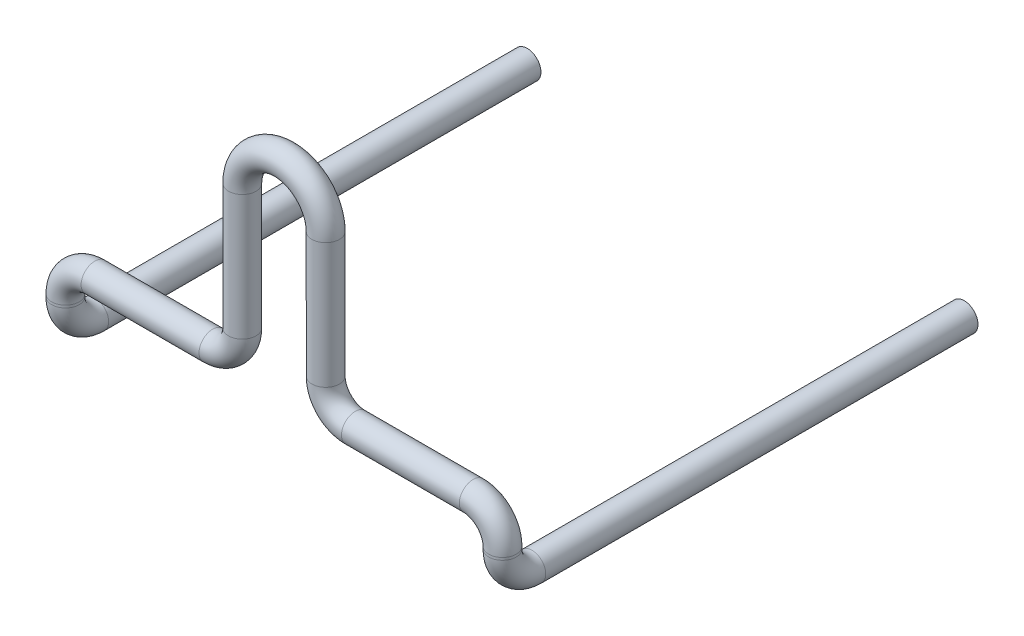
ISO-10303-21;
HEADER;
FILE_DESCRIPTION(('STEP AP214'),'2;1');
FILE_NAME('part.step','',(''),(''),'','','');
FILE_SCHEMA(('AUTOMOTIVE_DESIGN { 1 0 10303 214 1 1 1 1 }'));
ENDSEC;
DATA;
#1=APPLICATION_CONTEXT('core data for automotive mechanical design processes');
#2=APPLICATION_PROTOCOL_DEFINITION('international standard','automotive_design',2000,#1);
#3=PRODUCT_CONTEXT('',#1,'mechanical');
#4=PRODUCT('Part','Part','',(#3));
#5=PRODUCT_RELATED_PRODUCT_CATEGORY('part','',(#4));
#6=PRODUCT_DEFINITION_FORMATION('','',#4);
#7=PRODUCT_DEFINITION_CONTEXT('part definition',#1,'design');
#8=PRODUCT_DEFINITION('design','',#6,#7);
#9=PRODUCT_DEFINITION_SHAPE('','',#8);
#10=(LENGTH_UNIT() NAMED_UNIT(*) SI_UNIT(.MILLI.,.METRE.));
#11=(NAMED_UNIT(*) PLANE_ANGLE_UNIT() SI_UNIT($,.RADIAN.));
#12=(NAMED_UNIT(*) SI_UNIT($,.STERADIAN.) SOLID_ANGLE_UNIT());
#13=UNCERTAINTY_MEASURE_WITH_UNIT(LENGTH_MEASURE(1.E-05),#10,'distance_accuracy_value','');
#14=(GEOMETRIC_REPRESENTATION_CONTEXT(3) GLOBAL_UNCERTAINTY_ASSIGNED_CONTEXT((#13)) GLOBAL_UNIT_ASSIGNED_CONTEXT((#10,
#11,#12)) REPRESENTATION_CONTEXT('',''));
#15=CARTESIAN_POINT('',(0.,0.,0.));
#16=DIRECTION('',(0.,0.,1.));
#17=DIRECTION('',(1.,0.,0.));
#18=AXIS2_PLACEMENT_3D('',#15,#16,#17);
#19=CARTESIAN_POINT('',(22.2456860931195,0.,-3.00000000000003));
#20=DIRECTION('',(0.,0.,-1.));
#21=DIRECTION('',(-1.,0.,0.));
#22=AXIS2_PLACEMENT_3D('',#19,#20,#21);
#23=CYLINDRICAL_SURFACE('',#22,1.4);
#24=CARTESIAN_POINT('',(22.2456860931195,0.,-3.00000000000003));
#25=DIRECTION('',(0.,0.,-1.));
#26=DIRECTION('',(0.,1.,0.));
#27=AXIS2_PLACEMENT_3D('',#24,#25,#26);
#28=CIRCLE('',#27,1.4);
#29=CARTESIAN_POINT('',(22.2456860931195,-1.4,-3.00000000000004));
#30=VERTEX_POINT('',#29);
#31=EDGE_CURVE('E34',#30,#30,#28,.T.);
#32=ORIENTED_EDGE('',*,*,#31,.T.);
#33=EDGE_LOOP('',(#32));
#34=FACE_BOUND('',#33,.T.);
#35=CARTESIAN_POINT('',(22.2456860931195,0.,-47.));
#36=DIRECTION('',(0.,0.,-1.));
#37=DIRECTION('',(0.,1.,0.));
#38=AXIS2_PLACEMENT_3D('',#35,#36,#37);
#39=CIRCLE('',#38,1.4);
#40=CARTESIAN_POINT('',(22.2456860931195,1.4,-47.));
#41=VERTEX_POINT('',#40);
#42=EDGE_CURVE('E10',#41,#41,#39,.T.);
#43=ORIENTED_EDGE('',*,*,#42,.F.);
#44=EDGE_LOOP('',(#43));
#45=FACE_BOUND('',#44,.T.);
#46=ADVANCED_FACE('F28',(#34,#45),#23,.T.);
#47=CARTESIAN_POINT('',(22.2456860931195,3.,-3.));
#48=DIRECTION('',(1.,0.,0.));
#49=DIRECTION('',(0.,0.,-1.));
#50=AXIS2_PLACEMENT_3D('',#47,#48,#49);
#51=TOROIDAL_SURFACE('',#50,3.,1.4);
#52=CARTESIAN_POINT('',(22.2456860931195,3.00000000000002,0.));
#53=DIRECTION('',(0.,-1.,0.));
#54=DIRECTION('',(0.,0.,-1.));
#55=AXIS2_PLACEMENT_3D('',#52,#53,#54);
#56=CIRCLE('',#55,1.4);
#57=CARTESIAN_POINT('',(22.2456860931195,3.00000000000003,1.4));
#58=VERTEX_POINT('',#57);
#59=EDGE_CURVE('E38',#58,#58,#56,.T.);
#60=CARTESIAN_POINT('',(22.2456860931195,3.,-3.));
#61=DIRECTION('',(1.,0.,0.));
#62=DIRECTION('',(0.,0.,-1.));
#63=AXIS2_PLACEMENT_3D('',#60,#61,#62);
#64=CIRCLE('',#63,4.4);
#65=EDGE_CURVE('',#58,#30,#64,.T.);
#66=ORIENTED_EDGE('',*,*,#59,.T.);
#67=ORIENTED_EDGE('',*,*,#31,.F.);
#68=ORIENTED_EDGE('',*,*,#65,.T.);
#69=ORIENTED_EDGE('',*,*,#65,.F.);
#70=EDGE_LOOP('',(#66,#68,#67,#69));
#71=FACE_BOUND('',#70,.T.);
#72=ADVANCED_FACE('F135',(#71),#51,.T.);
#73=CARTESIAN_POINT('',(22.2456860931195,3.24999999999998,0.));
#74=DIRECTION('',(0.,-1.,0.));
#75=DIRECTION('',(0.,0.,-1.));
#76=AXIS2_PLACEMENT_3D('',#73,#74,#75);
#77=CYLINDRICAL_SURFACE('',#76,1.4);
#78=CARTESIAN_POINT('',(22.2456860931195,3.24999999999998,0.));
#79=DIRECTION('',(0.,-1.,0.));
#80=DIRECTION('',(0.,0.,-1.));
#81=AXIS2_PLACEMENT_3D('',#78,#79,#80);
#82=CIRCLE('',#81,1.4);
#83=CARTESIAN_POINT('',(23.6456860931195,3.24999999999997,0.));
#84=VERTEX_POINT('',#83);
#85=EDGE_CURVE('E42',#84,#84,#82,.T.);
#86=ORIENTED_EDGE('',*,*,#85,.T.);
#87=EDGE_LOOP('',(#86));
#88=FACE_BOUND('',#87,.T.);
#89=ORIENTED_EDGE('',*,*,#59,.F.);
#90=EDGE_LOOP('',(#89));
#91=FACE_BOUND('',#90,.T.);
#92=ADVANCED_FACE('F139',(#88,#91),#77,.T.);
#93=CARTESIAN_POINT('',(19.25,3.24999999999998,0.));
#94=DIRECTION('',(0.,0.,-1.));
#95=DIRECTION('',(-1.,0.,0.));
#96=AXIS2_PLACEMENT_3D('',#93,#94,#95);
#97=TOROIDAL_SURFACE('',#96,2.9956860931195,1.4);
#98=CARTESIAN_POINT('',(19.25,6.24568609311948,0.));
#99=DIRECTION('',(1.,0.,0.));
#100=DIRECTION('',(0.,0.,-1.));
#101=AXIS2_PLACEMENT_3D('',#98,#99,#100);
#102=CIRCLE('',#101,1.4);
#103=CARTESIAN_POINT('',(19.25,7.64568609311948,0.));
#104=VERTEX_POINT('',#103);
#105=EDGE_CURVE('E47',#104,#104,#102,.T.);
#106=CARTESIAN_POINT('',(19.25,3.24999999999998,0.));
#107=DIRECTION('',(0.,0.,-1.));
#108=DIRECTION('',(-1.,0.,0.));
#109=AXIS2_PLACEMENT_3D('',#106,#107,#108);
#110=CIRCLE('',#109,4.3956860931195);
#111=EDGE_CURVE('',#104,#84,#110,.T.);
#112=ORIENTED_EDGE('',*,*,#105,.T.);
#113=ORIENTED_EDGE('',*,*,#85,.F.);
#114=ORIENTED_EDGE('',*,*,#111,.T.);
#115=ORIENTED_EDGE('',*,*,#111,.F.);
#116=EDGE_LOOP('',(#112,#114,#113,#115));
#117=FACE_BOUND('',#116,.T.);
#118=ADVANCED_FACE('F145',(#117),#97,.T.);
#119=CARTESIAN_POINT('',(7.25,6.2456860931195,0.));
#120=DIRECTION('',(1.,0.,0.));
#121=DIRECTION('',(0.,1.,0.));
#122=AXIS2_PLACEMENT_3D('',#119,#120,#121);
#123=CYLINDRICAL_SURFACE('',#122,1.4);
#124=CARTESIAN_POINT('',(7.25,6.2456860931195,0.));
#125=DIRECTION('',(1.,0.,0.));
#126=DIRECTION('',(0.,0.,-1.));
#127=AXIS2_PLACEMENT_3D('',#124,#125,#126);
#128=CIRCLE('',#127,1.4);
#129=CARTESIAN_POINT('',(7.25,4.8456860931195,0.));
#130=VERTEX_POINT('',#129);
#131=EDGE_CURVE('E50',#130,#130,#128,.T.);
#132=ORIENTED_EDGE('',*,*,#131,.T.);
#133=EDGE_LOOP('',(#132));
#134=FACE_BOUND('',#133,.T.);
#135=ORIENTED_EDGE('',*,*,#105,.F.);
#136=EDGE_LOOP('',(#135));
#137=FACE_BOUND('',#136,.T.);
#138=ADVANCED_FACE('F152',(#134,#137),#123,.T.);
#139=CARTESIAN_POINT('',(7.25,9.25,0.));
#140=DIRECTION('',(0.,0.,1.));
#141=DIRECTION('',(1.,0.,0.));
#142=AXIS2_PLACEMENT_3D('',#139,#140,#141);
#143=TOROIDAL_SURFACE('',#142,3.0043139068805,1.4);
#144=CARTESIAN_POINT('',(4.2456860931195,9.25,0.));
#145=DIRECTION('',(0.,-1.,0.));
#146=DIRECTION('',(0.,0.,-1.));
#147=AXIS2_PLACEMENT_3D('',#144,#145,#146);
#148=CIRCLE('',#147,1.4);
#149=CARTESIAN_POINT('',(2.8456860931195,9.25,0.));
#150=VERTEX_POINT('',#149);
#151=EDGE_CURVE('E53',#150,#150,#148,.T.);
#152=CARTESIAN_POINT('',(7.25,9.25,0.));
#153=DIRECTION('',(0.,0.,1.));
#154=DIRECTION('',(1.,0.,0.));
#155=AXIS2_PLACEMENT_3D('',#152,#153,#154);
#156=CIRCLE('',#155,4.4043139068805);
#157=EDGE_CURVE('',#150,#130,#156,.T.);
#158=ORIENTED_EDGE('',*,*,#151,.T.);
#159=ORIENTED_EDGE('',*,*,#131,.F.);
#160=ORIENTED_EDGE('',*,*,#157,.T.);
#161=ORIENTED_EDGE('',*,*,#157,.F.);
#162=EDGE_LOOP('',(#158,#160,#159,#161));
#163=FACE_BOUND('',#162,.T.);
#164=ADVANCED_FACE('F156',(#163),#143,.T.);
#165=CARTESIAN_POINT('',(4.2456860931195,22.,0.));
#166=DIRECTION('',(0.,-1.,0.));
#167=DIRECTION('',(1.,0.,0.));
#168=AXIS2_PLACEMENT_3D('',#165,#166,#167);
#169=CYLINDRICAL_SURFACE('',#168,1.4);
#170=CARTESIAN_POINT('',(4.2456860931195,22.,0.));
#171=DIRECTION('',(0.,-1.,0.));
#172=DIRECTION('',(0.,0.,-1.));
#173=AXIS2_PLACEMENT_3D('',#170,#171,#172);
#174=CIRCLE('',#173,1.4);
#175=CARTESIAN_POINT('',(5.6456860931195,22.,0.));
#176=VERTEX_POINT('',#175);
#177=EDGE_CURVE('E56',#176,#176,#174,.T.);
#178=ORIENTED_EDGE('',*,*,#177,.T.);
#179=EDGE_LOOP('',(#178));
#180=FACE_BOUND('',#179,.T.);
#181=ORIENTED_EDGE('',*,*,#151,.F.);
#182=EDGE_LOOP('',(#181));
#183=FACE_BOUND('',#182,.T.);
#184=ADVANCED_FACE('F160',(#180,#183),#169,.T.);
#185=CARTESIAN_POINT('',(0.,22.,0.));
#186=DIRECTION('',(0.,0.,1.));
#187=DIRECTION('',(1.,0.,0.));
#188=AXIS2_PLACEMENT_3D('',#185,#186,#187);
#189=TOROIDAL_SURFACE('',#188,4.2456860931195,1.4);
#190=CARTESIAN_POINT('',(-4.2456860931195,22.,0.));
#191=DIRECTION('',(0.,1.,0.));
#192=DIRECTION('',(0.,0.,-1.));
#193=AXIS2_PLACEMENT_3D('',#190,#191,#192);
#194=CIRCLE('',#193,1.4);
#195=CARTESIAN_POINT('',(-5.6456860931195,22.,0.));
#196=VERTEX_POINT('',#195);
#197=EDGE_CURVE('E80',#196,#196,#194,.T.);
#198=CARTESIAN_POINT('',(0.,22.,0.));
#199=DIRECTION('',(0.,0.,1.));
#200=DIRECTION('',(1.,0.,0.));
#201=AXIS2_PLACEMENT_3D('',#198,#199,#200);
#202=CIRCLE('',#201,5.6456860931195);
#203=EDGE_CURVE('',#176,#196,#202,.T.);
#204=ORIENTED_EDGE('',*,*,#177,.F.);
#205=ORIENTED_EDGE('',*,*,#197,.T.);
#206=ORIENTED_EDGE('',*,*,#203,.T.);
#207=ORIENTED_EDGE('',*,*,#203,.F.);
#208=EDGE_LOOP('',(#204,#206,#205,#207));
#209=FACE_BOUND('',#208,.T.);
#210=ADVANCED_FACE('F84',(#209),#189,.T.);
#211=CARTESIAN_POINT('',(22.2456860931195,0.,-47.));
#212=DIRECTION('',(0.,0.,-1.));
#213=DIRECTION('',(0.,1.,0.));
#214=AXIS2_PLACEMENT_3D('',#211,#212,#213);
#215=PLANE('',#214);
#216=ORIENTED_EDGE('',*,*,#42,.T.);
#217=EDGE_LOOP('',(#216));
#218=FACE_BOUND('',#217,.T.);
#219=ADVANCED_FACE('F126',(#218),#215,.T.);
#220=CARTESIAN_POINT('',(-22.2456860931195,0.,-3.00000000000003));
#221=DIRECTION('',(0.,0.,-1.));
#222=DIRECTION('',(-1.,0.,0.));
#223=AXIS2_PLACEMENT_3D('',#220,#221,#222);
#224=CYLINDRICAL_SURFACE('',#223,1.4);
#225=CARTESIAN_POINT('',(-22.2456860931195,0.,-3.00000000000003));
#226=DIRECTION('',(0.,0.,1.));
#227=DIRECTION('',(0.,1.,0.));
#228=AXIS2_PLACEMENT_3D('',#225,#226,#227);
#229=CIRCLE('',#228,1.4);
#230=CARTESIAN_POINT('',(-22.2456860931195,-1.4,-3.00000000000004));
#231=VERTEX_POINT('',#230);
#232=EDGE_CURVE('E62',#231,#231,#229,.T.);
#233=ORIENTED_EDGE('',*,*,#232,.F.);
#234=EDGE_LOOP('',(#233));
#235=FACE_BOUND('',#234,.T.);
#236=CARTESIAN_POINT('',(-22.2456860931195,0.,-47.));
#237=DIRECTION('',(0.,0.,1.));
#238=DIRECTION('',(0.,1.,0.));
#239=AXIS2_PLACEMENT_3D('',#236,#237,#238);
#240=CIRCLE('',#239,1.4);
#241=CARTESIAN_POINT('',(-22.2456860931195,1.4,-47.));
#242=VERTEX_POINT('',#241);
#243=EDGE_CURVE('E59',#242,#242,#240,.T.);
#244=ORIENTED_EDGE('',*,*,#243,.T.);
#245=EDGE_LOOP('',(#244));
#246=FACE_BOUND('',#245,.T.);
#247=ADVANCED_FACE('F120',(#235,#246),#224,.T.);
#248=CARTESIAN_POINT('',(-22.2456860931195,3.,-3.));
#249=DIRECTION('',(1.,0.,0.));
#250=DIRECTION('',(0.,0.,-1.));
#251=AXIS2_PLACEMENT_3D('',#248,#249,#250);
#252=TOROIDAL_SURFACE('',#251,3.,1.4);
#253=CARTESIAN_POINT('',(-22.2456860931195,3.00000000000002,0.));
#254=DIRECTION('',(0.,1.,0.));
#255=DIRECTION('',(0.,0.,-1.));
#256=AXIS2_PLACEMENT_3D('',#253,#254,#255);
#257=CIRCLE('',#256,1.4);
#258=CARTESIAN_POINT('',(-22.2456860931195,3.00000000000003,1.4));
#259=VERTEX_POINT('',#258);
#260=EDGE_CURVE('E65',#259,#259,#257,.T.);
#261=CARTESIAN_POINT('',(-22.2456860931195,3.,-3.));
#262=DIRECTION('',(1.,0.,0.));
#263=DIRECTION('',(0.,0.,-1.));
#264=AXIS2_PLACEMENT_3D('',#261,#262,#263);
#265=CIRCLE('',#264,4.4);
#266=EDGE_CURVE('',#259,#231,#265,.T.);
#267=ORIENTED_EDGE('',*,*,#260,.F.);
#268=ORIENTED_EDGE('',*,*,#232,.T.);
#269=ORIENTED_EDGE('',*,*,#266,.T.);
#270=ORIENTED_EDGE('',*,*,#266,.F.);
#271=EDGE_LOOP('',(#267,#269,#268,#270));
#272=FACE_BOUND('',#271,.T.);
#273=ADVANCED_FACE('F114',(#272),#252,.T.);
#274=CARTESIAN_POINT('',(-22.2456860931195,3.24999999999998,0.));
#275=DIRECTION('',(0.,-1.,0.));
#276=DIRECTION('',(0.,0.,-1.));
#277=AXIS2_PLACEMENT_3D('',#274,#275,#276);
#278=CYLINDRICAL_SURFACE('',#277,1.4);
#279=CARTESIAN_POINT('',(-22.2456860931195,3.24999999999998,0.));
#280=DIRECTION('',(0.,1.,0.));
#281=DIRECTION('',(0.,0.,-1.));
#282=AXIS2_PLACEMENT_3D('',#279,#280,#281);
#283=CIRCLE('',#282,1.4);
#284=CARTESIAN_POINT('',(-23.6456860931195,3.24999999999997,0.));
#285=VERTEX_POINT('',#284);
#286=EDGE_CURVE('E68',#285,#285,#283,.T.);
#287=ORIENTED_EDGE('',*,*,#286,.F.);
#288=EDGE_LOOP('',(#287));
#289=FACE_BOUND('',#288,.T.);
#290=ORIENTED_EDGE('',*,*,#260,.T.);
#291=EDGE_LOOP('',(#290));
#292=FACE_BOUND('',#291,.T.);
#293=ADVANCED_FACE('F108',(#289,#292),#278,.T.);
#294=CARTESIAN_POINT('',(-19.25,3.24999999999998,0.));
#295=DIRECTION('',(0.,0.,1.));
#296=DIRECTION('',(1.,0.,0.));
#297=AXIS2_PLACEMENT_3D('',#294,#295,#296);
#298=TOROIDAL_SURFACE('',#297,2.9956860931195,1.4);
#299=CARTESIAN_POINT('',(-19.25,6.24568609311948,0.));
#300=DIRECTION('',(1.,0.,0.));
#301=DIRECTION('',(0.,0.,-1.));
#302=AXIS2_PLACEMENT_3D('',#299,#300,#301);
#303=CIRCLE('',#302,1.4);
#304=CARTESIAN_POINT('',(-19.25,7.64568609311948,0.));
#305=VERTEX_POINT('',#304);
#306=EDGE_CURVE('E71',#305,#305,#303,.T.);
#307=CARTESIAN_POINT('',(-19.25,3.24999999999998,0.));
#308=DIRECTION('',(0.,0.,1.));
#309=DIRECTION('',(1.,0.,0.));
#310=AXIS2_PLACEMENT_3D('',#307,#308,#309);
#311=CIRCLE('',#310,4.3956860931195);
#312=EDGE_CURVE('',#305,#285,#311,.T.);
#313=ORIENTED_EDGE('',*,*,#306,.F.);
#314=ORIENTED_EDGE('',*,*,#286,.T.);
#315=ORIENTED_EDGE('',*,*,#312,.T.);
#316=ORIENTED_EDGE('',*,*,#312,.F.);
#317=EDGE_LOOP('',(#313,#315,#314,#316));
#318=FACE_BOUND('',#317,.T.);
#319=ADVANCED_FACE('F102',(#318),#298,.T.);
#320=CARTESIAN_POINT('',(-7.25,6.2456860931195,0.));
#321=DIRECTION('',(-1.,0.,0.));
#322=DIRECTION('',(0.,-1.,0.));
#323=AXIS2_PLACEMENT_3D('',#320,#321,#322);
#324=CYLINDRICAL_SURFACE('',#323,1.4);
#325=CARTESIAN_POINT('',(-7.25,6.2456860931195,0.));
#326=DIRECTION('',(1.,0.,0.));
#327=DIRECTION('',(0.,0.,-1.));
#328=AXIS2_PLACEMENT_3D('',#325,#326,#327);
#329=CIRCLE('',#328,1.4);
#330=CARTESIAN_POINT('',(-7.25,4.8456860931195,0.));
#331=VERTEX_POINT('',#330);
#332=EDGE_CURVE('E74',#331,#331,#329,.T.);
#333=ORIENTED_EDGE('',*,*,#332,.F.);
#334=EDGE_LOOP('',(#333));
#335=FACE_BOUND('',#334,.T.);
#336=ORIENTED_EDGE('',*,*,#306,.T.);
#337=EDGE_LOOP('',(#336));
#338=FACE_BOUND('',#337,.T.);
#339=ADVANCED_FACE('F96',(#335,#338),#324,.T.);
#340=CARTESIAN_POINT('',(-7.25,9.25,0.));
#341=DIRECTION('',(0.,0.,-1.));
#342=DIRECTION('',(-1.,0.,0.));
#343=AXIS2_PLACEMENT_3D('',#340,#341,#342);
#344=TOROIDAL_SURFACE('',#343,3.0043139068805,1.4);
#345=CARTESIAN_POINT('',(-4.2456860931195,9.25,0.));
#346=DIRECTION('',(0.,1.,0.));
#347=DIRECTION('',(0.,0.,-1.));
#348=AXIS2_PLACEMENT_3D('',#345,#346,#347);
#349=CIRCLE('',#348,1.4);
#350=CARTESIAN_POINT('',(-2.8456860931195,9.25,0.));
#351=VERTEX_POINT('',#350);
#352=EDGE_CURVE('E77',#351,#351,#349,.T.);
#353=CARTESIAN_POINT('',(-7.25,9.25,0.));
#354=DIRECTION('',(0.,0.,-1.));
#355=DIRECTION('',(-1.,0.,0.));
#356=AXIS2_PLACEMENT_3D('',#353,#354,#355);
#357=CIRCLE('',#356,4.4043139068805);
#358=EDGE_CURVE('',#351,#331,#357,.T.);
#359=ORIENTED_EDGE('',*,*,#352,.F.);
#360=ORIENTED_EDGE('',*,*,#332,.T.);
#361=ORIENTED_EDGE('',*,*,#358,.T.);
#362=ORIENTED_EDGE('',*,*,#358,.F.);
#363=EDGE_LOOP('',(#359,#361,#360,#362));
#364=FACE_BOUND('',#363,.T.);
#365=ADVANCED_FACE('F90',(#364),#344,.T.);
#366=CARTESIAN_POINT('',(-4.2456860931195,22.,0.));
#367=DIRECTION('',(0.,-1.,0.));
#368=DIRECTION('',(1.,0.,0.));
#369=AXIS2_PLACEMENT_3D('',#366,#367,#368);
#370=CYLINDRICAL_SURFACE('',#369,1.4);
#371=ORIENTED_EDGE('',*,*,#197,.F.);
#372=EDGE_LOOP('',(#371));
#373=FACE_BOUND('',#372,.T.);
#374=ORIENTED_EDGE('',*,*,#352,.T.);
#375=EDGE_LOOP('',(#374));
#376=FACE_BOUND('',#375,.T.);
#377=ADVANCED_FACE('F86',(#373,#376),#370,.T.);
#378=CARTESIAN_POINT('',(-22.2456860931195,0.,-47.));
#379=DIRECTION('',(0.,0.,-1.));
#380=DIRECTION('',(0.,1.,0.));
#381=AXIS2_PLACEMENT_3D('',#378,#379,#380);
#382=PLANE('',#381);
#383=ORIENTED_EDGE('',*,*,#243,.F.);
#384=EDGE_LOOP('',(#383));
#385=FACE_BOUND('',#384,.T.);
#386=ADVANCED_FACE('F89',(#385),#382,.T.);
#387=CLOSED_SHELL('',(#46,#72,#92,#118,#138,#164,#184,#210,#219,#247,#273,#293,#319,#339,#365,
#377,#386));
#388=MANIFOLD_SOLID_BREP('B2',#387);
#389=ADVANCED_BREP_SHAPE_REPRESENTATION('',(#18,#388),#14);
#390=SHAPE_DEFINITION_REPRESENTATION(#9,#389);
ENDSEC;
END-ISO-10303-21;
